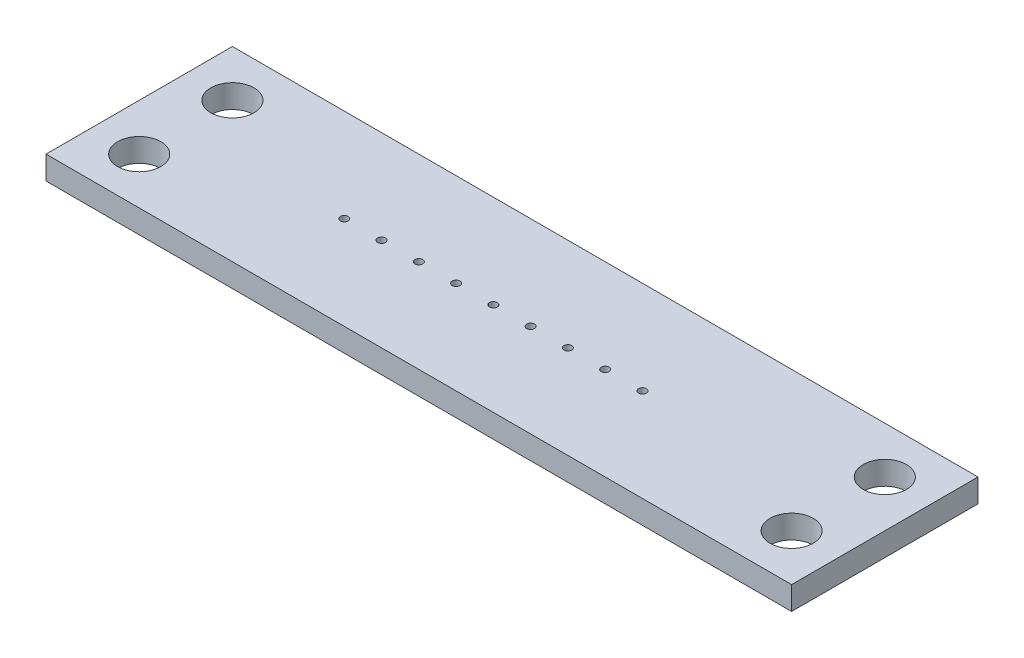
ISO-10303-21;
HEADER;
FILE_DESCRIPTION(('STEP AP214'),'2;1');
FILE_NAME('part.step','',(''),(''),'','','');
FILE_SCHEMA(('AUTOMOTIVE_DESIGN { 1 0 10303 214 1 1 1 1 }'));
ENDSEC;
DATA;
#1=APPLICATION_CONTEXT('core data for automotive mechanical design processes');
#2=APPLICATION_PROTOCOL_DEFINITION('international standard','automotive_design',2000,#1);
#3=PRODUCT_CONTEXT('',#1,'mechanical');
#4=PRODUCT('Part','Part','',(#3));
#5=PRODUCT_RELATED_PRODUCT_CATEGORY('part','',(#4));
#6=PRODUCT_DEFINITION_FORMATION('','',#4);
#7=PRODUCT_DEFINITION_CONTEXT('part definition',#1,'design');
#8=PRODUCT_DEFINITION('design','',#6,#7);
#9=PRODUCT_DEFINITION_SHAPE('','',#8);
#10=(LENGTH_UNIT() NAMED_UNIT(*) SI_UNIT(.MILLI.,.METRE.));
#11=(NAMED_UNIT(*) PLANE_ANGLE_UNIT() SI_UNIT($,.RADIAN.));
#12=(NAMED_UNIT(*) SI_UNIT($,.STERADIAN.) SOLID_ANGLE_UNIT());
#13=UNCERTAINTY_MEASURE_WITH_UNIT(LENGTH_MEASURE(1.E-05),#10,'distance_accuracy_value','');
#14=(GEOMETRIC_REPRESENTATION_CONTEXT(3) GLOBAL_UNCERTAINTY_ASSIGNED_CONTEXT((#13)) GLOBAL_UNIT_ASSIGNED_CONTEXT((#10,
#11,#12)) REPRESENTATION_CONTEXT('',''));
#15=CARTESIAN_POINT('',(0.,0.,0.));
#16=DIRECTION('',(0.,0.,1.));
#17=DIRECTION('',(1.,0.,0.));
#18=AXIS2_PLACEMENT_3D('',#15,#16,#17);
#19=CARTESIAN_POINT('',(0.,1.5875,0.));
#20=DIRECTION('',(1.,0.,0.));
#21=DIRECTION('',(0.,0.,-1.));
#22=AXIS2_PLACEMENT_3D('',#19,#20,#21);
#23=PLANE('',#22);
#24=DIRECTION('',(0.,0.,1.));
#25=VECTOR('',#24,1.);
#26=CARTESIAN_POINT('',(0.,0.,0.));
#27=LINE('',#26,#25);
#28=CARTESIAN_POINT('',(0.,0.,-12.7));
#29=VERTEX_POINT('',#28);
#30=CARTESIAN_POINT('',(0.,0.,0.));
#31=VERTEX_POINT('',#30);
#32=EDGE_CURVE('E96',#29,#31,#27,.T.);
#33=ORIENTED_EDGE('',*,*,#32,.T.);
#34=DIRECTION('',(0.,-1.,0.));
#35=VECTOR('',#34,1.);
#36=CARTESIAN_POINT('',(0.,1.5875,0.));
#37=LINE('',#36,#35);
#38=CARTESIAN_POINT('',(0.,1.5875,0.));
#39=VERTEX_POINT('',#38);
#40=EDGE_CURVE('E11',#39,#31,#37,.T.);
#41=ORIENTED_EDGE('',*,*,#40,.F.);
#42=DIRECTION('',(0.,0.,1.));
#43=VECTOR('',#42,1.);
#44=CARTESIAN_POINT('',(0.,1.5875,0.));
#45=LINE('',#44,#43);
#46=CARTESIAN_POINT('',(0.,1.5875,-12.7));
#47=VERTEX_POINT('',#46);
#48=EDGE_CURVE('E84',#47,#39,#45,.T.);
#49=ORIENTED_EDGE('',*,*,#48,.F.);
#50=DIRECTION('',(0.,-1.,0.));
#51=VECTOR('',#50,1.);
#52=CARTESIAN_POINT('',(0.,1.5875,-12.7));
#53=LINE('',#52,#51);
#54=EDGE_CURVE('E92',#47,#29,#53,.T.);
#55=ORIENTED_EDGE('',*,*,#54,.T.);
#56=EDGE_LOOP('',(#33,#41,#49,#55));
#57=FACE_BOUND('',#56,.T.);
#58=ADVANCED_FACE('F33',(#57),#23,.F.);
#59=CARTESIAN_POINT('',(0.,1.5875,0.));
#60=DIRECTION('',(0.,0.,-1.));
#61=DIRECTION('',(-1.,0.,0.));
#62=AXIS2_PLACEMENT_3D('',#59,#60,#61);
#63=PLANE('',#62);
#64=DIRECTION('',(1.,0.,0.));
#65=VECTOR('',#64,1.);
#66=CARTESIAN_POINT('',(0.,0.,0.));
#67=LINE('',#66,#65);
#68=CARTESIAN_POINT('',(50.8,0.,0.));
#69=VERTEX_POINT('',#68);
#70=EDGE_CURVE('E88',#31,#69,#67,.T.);
#71=ORIENTED_EDGE('',*,*,#70,.T.);
#72=DIRECTION('',(0.,-1.,0.));
#73=VECTOR('',#72,1.);
#74=CARTESIAN_POINT('',(50.8,1.5875,0.));
#75=LINE('',#74,#73);
#76=CARTESIAN_POINT('',(50.8,1.5875,0.));
#77=VERTEX_POINT('',#76);
#78=EDGE_CURVE('E41',#77,#69,#75,.T.);
#79=ORIENTED_EDGE('',*,*,#78,.F.);
#80=DIRECTION('',(1.,0.,0.));
#81=VECTOR('',#80,1.);
#82=CARTESIAN_POINT('',(0.,1.5875,0.));
#83=LINE('',#82,#81);
#84=EDGE_CURVE('E79',#39,#77,#83,.T.);
#85=ORIENTED_EDGE('',*,*,#84,.F.);
#86=ORIENTED_EDGE('',*,*,#40,.T.);
#87=EDGE_LOOP('',(#71,#79,#85,#86));
#88=FACE_BOUND('',#87,.T.);
#89=ADVANCED_FACE('F87',(#88),#63,.F.);
#90=CARTESIAN_POINT('',(50.8,1.5875,0.));
#91=DIRECTION('',(-1.,0.,0.));
#92=DIRECTION('',(0.,0.,1.));
#93=AXIS2_PLACEMENT_3D('',#90,#91,#92);
#94=PLANE('',#93);
#95=DIRECTION('',(0.,0.,-1.));
#96=VECTOR('',#95,1.);
#97=CARTESIAN_POINT('',(50.8,0.,0.));
#98=LINE('',#97,#96);
#99=CARTESIAN_POINT('',(50.8,0.,-12.7));
#100=VERTEX_POINT('',#99);
#101=EDGE_CURVE('E66',#69,#100,#98,.T.);
#102=ORIENTED_EDGE('',*,*,#101,.T.);
#103=DIRECTION('',(0.,-1.,0.));
#104=VECTOR('',#103,1.);
#105=CARTESIAN_POINT('',(50.8,1.5875,-12.7));
#106=LINE('',#105,#104);
#107=CARTESIAN_POINT('',(50.8,1.5875,-12.7));
#108=VERTEX_POINT('',#107);
#109=EDGE_CURVE('E89',#108,#100,#106,.T.);
#110=ORIENTED_EDGE('',*,*,#109,.F.);
#111=DIRECTION('',(0.,0.,-1.));
#112=VECTOR('',#111,1.);
#113=CARTESIAN_POINT('',(50.8,1.5875,0.));
#114=LINE('',#113,#112);
#115=EDGE_CURVE('E82',#77,#108,#114,.T.);
#116=ORIENTED_EDGE('',*,*,#115,.F.);
#117=ORIENTED_EDGE('',*,*,#78,.T.);
#118=EDGE_LOOP('',(#102,#110,#116,#117));
#119=FACE_BOUND('',#118,.T.);
#120=ADVANCED_FACE('F90',(#119),#94,.F.);
#121=CARTESIAN_POINT('',(0.,1.5875,-12.7));
#122=DIRECTION('',(0.,0.,1.));
#123=DIRECTION('',(1.,0.,0.));
#124=AXIS2_PLACEMENT_3D('',#121,#122,#123);
#125=PLANE('',#124);
#126=DIRECTION('',(-1.,0.,0.));
#127=VECTOR('',#126,1.);
#128=CARTESIAN_POINT('',(0.,0.,-12.7));
#129=LINE('',#128,#127);
#130=EDGE_CURVE('E72',#100,#29,#129,.T.);
#131=ORIENTED_EDGE('',*,*,#130,.T.);
#132=ORIENTED_EDGE('',*,*,#54,.F.);
#133=DIRECTION('',(-1.,0.,0.));
#134=VECTOR('',#133,1.);
#135=CARTESIAN_POINT('',(0.,1.5875,-12.7));
#136=LINE('',#135,#134);
#137=EDGE_CURVE('E49',#108,#47,#136,.T.);
#138=ORIENTED_EDGE('',*,*,#137,.F.);
#139=ORIENTED_EDGE('',*,*,#109,.T.);
#140=EDGE_LOOP('',(#131,#132,#138,#139));
#141=FACE_BOUND('',#140,.T.);
#142=ADVANCED_FACE('F104',(#141),#125,.F.);
#143=CARTESIAN_POINT('',(0.,1.5875,0.));
#144=DIRECTION('',(0.,-1.,0.));
#145=DIRECTION('',(0.,0.,-1.));
#146=AXIS2_PLACEMENT_3D('',#143,#144,#145);
#147=PLANE('',#146);
#148=CARTESIAN_POINT('',(34.29,1.5875,-6.35));
#149=DIRECTION('',(0.,1.,0.));
#150=DIRECTION('',(0.,0.,1.));
#151=AXIS2_PLACEMENT_3D('',#148,#149,#150);
#152=CIRCLE('',#151,0.266700000000002);
#153=CARTESIAN_POINT('',(34.29,1.5875,-6.0833));
#154=VERTEX_POINT('',#153);
#155=EDGE_CURVE('E140',#154,#154,#152,.T.);
#156=ORIENTED_EDGE('',*,*,#155,.F.);
#157=EDGE_LOOP('',(#156));
#158=FACE_BOUND('',#157,.T.);
#159=CARTESIAN_POINT('',(31.75,1.5875,-6.35));
#160=DIRECTION('',(0.,1.,0.));
#161=DIRECTION('',(0.,0.,1.));
#162=AXIS2_PLACEMENT_3D('',#159,#160,#161);
#163=CIRCLE('',#162,0.266700000000002);
#164=CARTESIAN_POINT('',(31.75,1.5875,-6.0833));
#165=VERTEX_POINT('',#164);
#166=EDGE_CURVE('E146',#165,#165,#163,.T.);
#167=ORIENTED_EDGE('',*,*,#166,.F.);
#168=EDGE_LOOP('',(#167));
#169=FACE_BOUND('',#168,.T.);
#170=CARTESIAN_POINT('',(29.21,1.5875,-6.35));
#171=DIRECTION('',(0.,1.,0.));
#172=DIRECTION('',(0.,0.,1.));
#173=AXIS2_PLACEMENT_3D('',#170,#171,#172);
#174=CIRCLE('',#173,0.266700000000002);
#175=CARTESIAN_POINT('',(29.21,1.5875,-6.0833));
#176=VERTEX_POINT('',#175);
#177=EDGE_CURVE('E152',#176,#176,#174,.T.);
#178=ORIENTED_EDGE('',*,*,#177,.F.);
#179=EDGE_LOOP('',(#178));
#180=FACE_BOUND('',#179,.T.);
#181=CARTESIAN_POINT('',(26.67,1.5875,-6.35));
#182=DIRECTION('',(0.,1.,0.));
#183=DIRECTION('',(0.,0.,1.));
#184=AXIS2_PLACEMENT_3D('',#181,#182,#183);
#185=CIRCLE('',#184,0.266700000000002);
#186=CARTESIAN_POINT('',(26.67,1.5875,-6.0833));
#187=VERTEX_POINT('',#186);
#188=EDGE_CURVE('E158',#187,#187,#185,.T.);
#189=ORIENTED_EDGE('',*,*,#188,.F.);
#190=EDGE_LOOP('',(#189));
#191=FACE_BOUND('',#190,.T.);
#192=CARTESIAN_POINT('',(13.97,1.5875,-6.34999999999993));
#193=DIRECTION('',(0.,1.,0.));
#194=DIRECTION('',(0.,0.,1.));
#195=AXIS2_PLACEMENT_3D('',#192,#193,#194);
#196=CIRCLE('',#195,0.266700000000002);
#197=CARTESIAN_POINT('',(13.97,1.5875,-6.08329999999993));
#198=VERTEX_POINT('',#197);
#199=EDGE_CURVE('E164',#198,#198,#196,.T.);
#200=ORIENTED_EDGE('',*,*,#199,.F.);
#201=EDGE_LOOP('',(#200));
#202=FACE_BOUND('',#201,.T.);
#203=CARTESIAN_POINT('',(16.51,1.5875,-6.34999999999995));
#204=DIRECTION('',(0.,1.,0.));
#205=DIRECTION('',(0.,0.,1.));
#206=AXIS2_PLACEMENT_3D('',#203,#204,#205);
#207=CIRCLE('',#206,0.266700000000002);
#208=CARTESIAN_POINT('',(16.51,1.5875,-6.08329999999994));
#209=VERTEX_POINT('',#208);
#210=EDGE_CURVE('E170',#209,#209,#207,.T.);
#211=ORIENTED_EDGE('',*,*,#210,.F.);
#212=EDGE_LOOP('',(#211));
#213=FACE_BOUND('',#212,.T.);
#214=CARTESIAN_POINT('',(19.05,1.5875,-6.34999999999996));
#215=DIRECTION('',(0.,1.,0.));
#216=DIRECTION('',(0.,0.,1.));
#217=AXIS2_PLACEMENT_3D('',#214,#215,#216);
#218=CIRCLE('',#217,0.266700000000002);
#219=CARTESIAN_POINT('',(19.05,1.5875,-6.08329999999996));
#220=VERTEX_POINT('',#219);
#221=EDGE_CURVE('E176',#220,#220,#218,.T.);
#222=ORIENTED_EDGE('',*,*,#221,.F.);
#223=EDGE_LOOP('',(#222));
#224=FACE_BOUND('',#223,.T.);
#225=CARTESIAN_POINT('',(21.59,1.5875,-6.34999999999998));
#226=DIRECTION('',(0.,1.,0.));
#227=DIRECTION('',(0.,0.,1.));
#228=AXIS2_PLACEMENT_3D('',#225,#226,#227);
#229=CIRCLE('',#228,0.266700000000002);
#230=CARTESIAN_POINT('',(21.59,1.5875,-6.08329999999998));
#231=VERTEX_POINT('',#230);
#232=EDGE_CURVE('E182',#231,#231,#229,.T.);
#233=ORIENTED_EDGE('',*,*,#232,.F.);
#234=EDGE_LOOP('',(#233));
#235=FACE_BOUND('',#234,.T.);
#236=CARTESIAN_POINT('',(24.13,1.5875,-6.35));
#237=DIRECTION('',(0.,1.,0.));
#238=DIRECTION('',(0.,0.,1.));
#239=AXIS2_PLACEMENT_3D('',#236,#237,#238);
#240=CIRCLE('',#239,0.266700000000002);
#241=CARTESIAN_POINT('',(24.13,1.5875,-6.0833));
#242=VERTEX_POINT('',#241);
#243=EDGE_CURVE('E134',#242,#242,#240,.T.);
#244=ORIENTED_EDGE('',*,*,#243,.F.);
#245=EDGE_LOOP('',(#244));
#246=FACE_BOUND('',#245,.T.);
#247=CARTESIAN_POINT('',(3.175,1.5875,-3.175));
#248=DIRECTION('',(0.,1.,0.));
#249=DIRECTION('',(0.,0.,-1.));
#250=AXIS2_PLACEMENT_3D('',#247,#248,#249);
#251=CIRCLE('',#250,1.4732);
#252=CARTESIAN_POINT('',(3.175,1.5875,-4.6482));
#253=VERTEX_POINT('',#252);
#254=EDGE_CURVE('E123',#253,#253,#251,.T.);
#255=ORIENTED_EDGE('',*,*,#254,.F.);
#256=EDGE_LOOP('',(#255));
#257=FACE_BOUND('',#256,.T.);
#258=CARTESIAN_POINT('',(47.625,1.5875,-9.525));
#259=DIRECTION('',(0.,1.,0.));
#260=DIRECTION('',(0.,0.,-1.));
#261=AXIS2_PLACEMENT_3D('',#258,#259,#260);
#262=CIRCLE('',#261,1.4732);
#263=CARTESIAN_POINT('',(47.625,1.5875,-10.9982));
#264=VERTEX_POINT('',#263);
#265=EDGE_CURVE('E116',#264,#264,#262,.T.);
#266=ORIENTED_EDGE('',*,*,#265,.F.);
#267=EDGE_LOOP('',(#266));
#268=FACE_BOUND('',#267,.T.);
#269=CARTESIAN_POINT('',(47.625,1.5875,-3.17500000000001));
#270=DIRECTION('',(0.,1.,0.));
#271=DIRECTION('',(0.,0.,1.));
#272=AXIS2_PLACEMENT_3D('',#269,#270,#271);
#273=CIRCLE('',#272,1.4732);
#274=CARTESIAN_POINT('',(47.625,1.5875,-1.70180000000002));
#275=VERTEX_POINT('',#274);
#276=EDGE_CURVE('E128',#275,#275,#273,.T.);
#277=ORIENTED_EDGE('',*,*,#276,.F.);
#278=EDGE_LOOP('',(#277));
#279=FACE_BOUND('',#278,.T.);
#280=CARTESIAN_POINT('',(3.175,1.5875,-9.525));
#281=DIRECTION('',(0.,1.,0.));
#282=DIRECTION('',(0.,0.,1.));
#283=AXIS2_PLACEMENT_3D('',#280,#281,#282);
#284=CIRCLE('',#283,1.4732);
#285=CARTESIAN_POINT('',(3.175,1.5875,-8.0518));
#286=VERTEX_POINT('',#285);
#287=EDGE_CURVE('E110',#286,#286,#284,.T.);
#288=ORIENTED_EDGE('',*,*,#287,.F.);
#289=EDGE_LOOP('',(#288));
#290=FACE_BOUND('',#289,.T.);
#291=ORIENTED_EDGE('',*,*,#48,.T.);
#292=ORIENTED_EDGE('',*,*,#84,.T.);
#293=ORIENTED_EDGE('',*,*,#115,.T.);
#294=ORIENTED_EDGE('',*,*,#137,.T.);
#295=EDGE_LOOP('',(#291,#292,#293,#294));
#296=FACE_BOUND('',#295,.T.);
#297=ADVANCED_FACE('F80',(#158,#169,#180,#191,#202,#213,#224,#235,#246,#257,#268,#279,#290,
#296),#147,.F.);
#298=CARTESIAN_POINT('',(0.,0.,0.));
#299=DIRECTION('',(0.,-1.,0.));
#300=DIRECTION('',(0.,0.,-1.));
#301=AXIS2_PLACEMENT_3D('',#298,#299,#300);
#302=PLANE('',#301);
#303=CARTESIAN_POINT('',(34.29,0.,-6.35));
#304=DIRECTION('',(0.,1.,0.));
#305=DIRECTION('',(0.,0.,1.));
#306=AXIS2_PLACEMENT_3D('',#303,#304,#305);
#307=CIRCLE('',#306,0.266700000000002);
#308=CARTESIAN_POINT('',(34.29,0.,-6.0833));
#309=VERTEX_POINT('',#308);
#310=EDGE_CURVE('E143',#309,#309,#307,.T.);
#311=ORIENTED_EDGE('',*,*,#310,.T.);
#312=EDGE_LOOP('',(#311));
#313=FACE_BOUND('',#312,.T.);
#314=CARTESIAN_POINT('',(31.75,0.,-6.35));
#315=DIRECTION('',(0.,1.,0.));
#316=DIRECTION('',(0.,0.,1.));
#317=AXIS2_PLACEMENT_3D('',#314,#315,#316);
#318=CIRCLE('',#317,0.266700000000002);
#319=CARTESIAN_POINT('',(31.75,0.,-6.0833));
#320=VERTEX_POINT('',#319);
#321=EDGE_CURVE('E149',#320,#320,#318,.T.);
#322=ORIENTED_EDGE('',*,*,#321,.T.);
#323=EDGE_LOOP('',(#322));
#324=FACE_BOUND('',#323,.T.);
#325=CARTESIAN_POINT('',(29.21,0.,-6.35));
#326=DIRECTION('',(0.,1.,0.));
#327=DIRECTION('',(0.,0.,1.));
#328=AXIS2_PLACEMENT_3D('',#325,#326,#327);
#329=CIRCLE('',#328,0.266700000000002);
#330=CARTESIAN_POINT('',(29.21,0.,-6.0833));
#331=VERTEX_POINT('',#330);
#332=EDGE_CURVE('E155',#331,#331,#329,.T.);
#333=ORIENTED_EDGE('',*,*,#332,.T.);
#334=EDGE_LOOP('',(#333));
#335=FACE_BOUND('',#334,.T.);
#336=CARTESIAN_POINT('',(26.67,0.,-6.35));
#337=DIRECTION('',(0.,1.,0.));
#338=DIRECTION('',(0.,0.,1.));
#339=AXIS2_PLACEMENT_3D('',#336,#337,#338);
#340=CIRCLE('',#339,0.266700000000002);
#341=CARTESIAN_POINT('',(26.67,0.,-6.0833));
#342=VERTEX_POINT('',#341);
#343=EDGE_CURVE('E161',#342,#342,#340,.T.);
#344=ORIENTED_EDGE('',*,*,#343,.T.);
#345=EDGE_LOOP('',(#344));
#346=FACE_BOUND('',#345,.T.);
#347=CARTESIAN_POINT('',(13.97,0.,-6.34999999999993));
#348=DIRECTION('',(0.,1.,0.));
#349=DIRECTION('',(0.,0.,1.));
#350=AXIS2_PLACEMENT_3D('',#347,#348,#349);
#351=CIRCLE('',#350,0.266700000000002);
#352=CARTESIAN_POINT('',(13.97,0.,-6.08329999999993));
#353=VERTEX_POINT('',#352);
#354=EDGE_CURVE('E167',#353,#353,#351,.T.);
#355=ORIENTED_EDGE('',*,*,#354,.T.);
#356=EDGE_LOOP('',(#355));
#357=FACE_BOUND('',#356,.T.);
#358=CARTESIAN_POINT('',(16.51,0.,-6.34999999999995));
#359=DIRECTION('',(0.,1.,0.));
#360=DIRECTION('',(0.,0.,1.));
#361=AXIS2_PLACEMENT_3D('',#358,#359,#360);
#362=CIRCLE('',#361,0.266700000000002);
#363=CARTESIAN_POINT('',(16.51,0.,-6.08329999999994));
#364=VERTEX_POINT('',#363);
#365=EDGE_CURVE('E173',#364,#364,#362,.T.);
#366=ORIENTED_EDGE('',*,*,#365,.T.);
#367=EDGE_LOOP('',(#366));
#368=FACE_BOUND('',#367,.T.);
#369=CARTESIAN_POINT('',(19.05,0.,-6.34999999999996));
#370=DIRECTION('',(0.,1.,0.));
#371=DIRECTION('',(0.,0.,1.));
#372=AXIS2_PLACEMENT_3D('',#369,#370,#371);
#373=CIRCLE('',#372,0.266700000000002);
#374=CARTESIAN_POINT('',(19.05,0.,-6.08329999999996));
#375=VERTEX_POINT('',#374);
#376=EDGE_CURVE('E179',#375,#375,#373,.T.);
#377=ORIENTED_EDGE('',*,*,#376,.T.);
#378=EDGE_LOOP('',(#377));
#379=FACE_BOUND('',#378,.T.);
#380=CARTESIAN_POINT('',(21.59,0.,-6.34999999999998));
#381=DIRECTION('',(0.,1.,0.));
#382=DIRECTION('',(0.,0.,1.));
#383=AXIS2_PLACEMENT_3D('',#380,#381,#382);
#384=CIRCLE('',#383,0.266700000000002);
#385=CARTESIAN_POINT('',(21.59,0.,-6.08329999999998));
#386=VERTEX_POINT('',#385);
#387=EDGE_CURVE('E137',#386,#386,#384,.T.);
#388=ORIENTED_EDGE('',*,*,#387,.T.);
#389=EDGE_LOOP('',(#388));
#390=FACE_BOUND('',#389,.T.);
#391=CARTESIAN_POINT('',(24.13,0.,-6.35));
#392=DIRECTION('',(0.,1.,0.));
#393=DIRECTION('',(0.,0.,1.));
#394=AXIS2_PLACEMENT_3D('',#391,#392,#393);
#395=CIRCLE('',#394,0.266700000000002);
#396=CARTESIAN_POINT('',(24.13,0.,-6.0833));
#397=VERTEX_POINT('',#396);
#398=EDGE_CURVE('E131',#397,#397,#395,.T.);
#399=ORIENTED_EDGE('',*,*,#398,.T.);
#400=EDGE_LOOP('',(#399));
#401=FACE_BOUND('',#400,.T.);
#402=CARTESIAN_POINT('',(3.175,0.,-3.175));
#403=DIRECTION('',(0.,1.,0.));
#404=DIRECTION('',(0.,0.,-1.));
#405=AXIS2_PLACEMENT_3D('',#402,#403,#404);
#406=CIRCLE('',#405,1.4732);
#407=CARTESIAN_POINT('',(3.175,0.,-4.6482));
#408=VERTEX_POINT('',#407);
#409=EDGE_CURVE('E113',#408,#408,#406,.T.);
#410=ORIENTED_EDGE('',*,*,#409,.T.);
#411=EDGE_LOOP('',(#410));
#412=FACE_BOUND('',#411,.T.);
#413=CARTESIAN_POINT('',(47.625,0.,-9.525));
#414=DIRECTION('',(0.,1.,0.));
#415=DIRECTION('',(0.,0.,-1.));
#416=AXIS2_PLACEMENT_3D('',#413,#414,#415);
#417=CIRCLE('',#416,1.4732);
#418=CARTESIAN_POINT('',(47.625,0.,-10.9982));
#419=VERTEX_POINT('',#418);
#420=EDGE_CURVE('E119',#419,#419,#417,.T.);
#421=ORIENTED_EDGE('',*,*,#420,.T.);
#422=EDGE_LOOP('',(#421));
#423=FACE_BOUND('',#422,.T.);
#424=CARTESIAN_POINT('',(47.625,0.,-3.17500000000001));
#425=DIRECTION('',(0.,1.,0.));
#426=DIRECTION('',(0.,0.,1.));
#427=AXIS2_PLACEMENT_3D('',#424,#425,#426);
#428=CIRCLE('',#427,1.4732);
#429=CARTESIAN_POINT('',(47.625,0.,-1.70180000000002));
#430=VERTEX_POINT('',#429);
#431=EDGE_CURVE('E120',#430,#430,#428,.T.);
#432=ORIENTED_EDGE('',*,*,#431,.T.);
#433=EDGE_LOOP('',(#432));
#434=FACE_BOUND('',#433,.T.);
#435=CARTESIAN_POINT('',(3.175,0.,-9.525));
#436=DIRECTION('',(0.,1.,0.));
#437=DIRECTION('',(0.,0.,1.));
#438=AXIS2_PLACEMENT_3D('',#435,#436,#437);
#439=CIRCLE('',#438,1.4732);
#440=CARTESIAN_POINT('',(3.175,0.,-8.0518));
#441=VERTEX_POINT('',#440);
#442=EDGE_CURVE('E99',#441,#441,#439,.T.);
#443=ORIENTED_EDGE('',*,*,#442,.T.);
#444=EDGE_LOOP('',(#443));
#445=FACE_BOUND('',#444,.T.);
#446=ORIENTED_EDGE('',*,*,#32,.F.);
#447=ORIENTED_EDGE('',*,*,#130,.F.);
#448=ORIENTED_EDGE('',*,*,#101,.F.);
#449=ORIENTED_EDGE('',*,*,#70,.F.);
#450=EDGE_LOOP('',(#446,#447,#448,#449));
#451=FACE_BOUND('',#450,.T.);
#452=ADVANCED_FACE('F107',(#313,#324,#335,#346,#357,#368,#379,#390,#401,#412,#423,#434,#445,
#451),#302,.T.);
#453=CARTESIAN_POINT('',(3.175,0.,-9.525));
#454=DIRECTION('',(0.,1.,0.));
#455=DIRECTION('',(0.,0.,1.));
#456=AXIS2_PLACEMENT_3D('',#453,#454,#455);
#457=CYLINDRICAL_SURFACE('',#456,1.4732);
#458=ORIENTED_EDGE('',*,*,#442,.F.);
#459=EDGE_LOOP('',(#458));
#460=FACE_BOUND('',#459,.T.);
#461=ORIENTED_EDGE('',*,*,#287,.T.);
#462=EDGE_LOOP('',(#461));
#463=FACE_BOUND('',#462,.T.);
#464=ADVANCED_FACE('F212',(#460,#463),#457,.F.);
#465=CARTESIAN_POINT('',(47.625,0.,-3.17500000000001));
#466=DIRECTION('',(0.,1.,0.));
#467=DIRECTION('',(0.,0.,1.));
#468=AXIS2_PLACEMENT_3D('',#465,#466,#467);
#469=CYLINDRICAL_SURFACE('',#468,1.4732);
#470=ORIENTED_EDGE('',*,*,#431,.F.);
#471=EDGE_LOOP('',(#470));
#472=FACE_BOUND('',#471,.T.);
#473=ORIENTED_EDGE('',*,*,#276,.T.);
#474=EDGE_LOOP('',(#473));
#475=FACE_BOUND('',#474,.T.);
#476=ADVANCED_FACE('F214',(#472,#475),#469,.F.);
#477=CARTESIAN_POINT('',(47.625,0.,-9.525));
#478=DIRECTION('',(0.,1.,0.));
#479=DIRECTION('',(0.,0.,1.));
#480=AXIS2_PLACEMENT_3D('',#477,#478,#479);
#481=CYLINDRICAL_SURFACE('',#480,1.4732);
#482=ORIENTED_EDGE('',*,*,#420,.F.);
#483=EDGE_LOOP('',(#482));
#484=FACE_BOUND('',#483,.T.);
#485=ORIENTED_EDGE('',*,*,#265,.T.);
#486=EDGE_LOOP('',(#485));
#487=FACE_BOUND('',#486,.T.);
#488=ADVANCED_FACE('F221',(#484,#487),#481,.F.);
#489=CARTESIAN_POINT('',(3.175,0.,-3.175));
#490=DIRECTION('',(0.,1.,0.));
#491=DIRECTION('',(0.,0.,1.));
#492=AXIS2_PLACEMENT_3D('',#489,#490,#491);
#493=CYLINDRICAL_SURFACE('',#492,1.4732);
#494=ORIENTED_EDGE('',*,*,#409,.F.);
#495=EDGE_LOOP('',(#494));
#496=FACE_BOUND('',#495,.T.);
#497=ORIENTED_EDGE('',*,*,#254,.T.);
#498=EDGE_LOOP('',(#497));
#499=FACE_BOUND('',#498,.T.);
#500=ADVANCED_FACE('F261',(#496,#499),#493,.F.);
#501=CARTESIAN_POINT('',(24.13,0.,-6.35));
#502=DIRECTION('',(0.,1.,0.));
#503=DIRECTION('',(0.,0.,1.));
#504=AXIS2_PLACEMENT_3D('',#501,#502,#503);
#505=CYLINDRICAL_SURFACE('',#504,0.266700000000002);
#506=ORIENTED_EDGE('',*,*,#398,.F.);
#507=EDGE_LOOP('',(#506));
#508=FACE_BOUND('',#507,.T.);
#509=ORIENTED_EDGE('',*,*,#243,.T.);
#510=EDGE_LOOP('',(#509));
#511=FACE_BOUND('',#510,.T.);
#512=ADVANCED_FACE('F194',(#508,#511),#505,.F.);
#513=CARTESIAN_POINT('',(21.59,0.,-6.34999999999998));
#514=DIRECTION('',(0.,1.,0.));
#515=DIRECTION('',(0.,0.,1.));
#516=AXIS2_PLACEMENT_3D('',#513,#514,#515);
#517=CYLINDRICAL_SURFACE('',#516,0.266700000000002);
#518=ORIENTED_EDGE('',*,*,#387,.F.);
#519=EDGE_LOOP('',(#518));
#520=FACE_BOUND('',#519,.T.);
#521=ORIENTED_EDGE('',*,*,#232,.T.);
#522=EDGE_LOOP('',(#521));
#523=FACE_BOUND('',#522,.T.);
#524=ADVANCED_FACE('F190',(#520,#523),#517,.F.);
#525=CARTESIAN_POINT('',(19.05,0.,-6.34999999999996));
#526=DIRECTION('',(0.,1.,0.));
#527=DIRECTION('',(0.,0.,1.));
#528=AXIS2_PLACEMENT_3D('',#525,#526,#527);
#529=CYLINDRICAL_SURFACE('',#528,0.266700000000002);
#530=ORIENTED_EDGE('',*,*,#376,.F.);
#531=EDGE_LOOP('',(#530));
#532=FACE_BOUND('',#531,.T.);
#533=ORIENTED_EDGE('',*,*,#221,.T.);
#534=EDGE_LOOP('',(#533));
#535=FACE_BOUND('',#534,.T.);
#536=ADVANCED_FACE('F193',(#532,#535),#529,.F.);
#537=CARTESIAN_POINT('',(16.51,0.,-6.34999999999995));
#538=DIRECTION('',(0.,1.,0.));
#539=DIRECTION('',(0.,0.,1.));
#540=AXIS2_PLACEMENT_3D('',#537,#538,#539);
#541=CYLINDRICAL_SURFACE('',#540,0.266700000000002);
#542=ORIENTED_EDGE('',*,*,#365,.F.);
#543=EDGE_LOOP('',(#542));
#544=FACE_BOUND('',#543,.T.);
#545=ORIENTED_EDGE('',*,*,#210,.T.);
#546=EDGE_LOOP('',(#545));
#547=FACE_BOUND('',#546,.T.);
#548=ADVANCED_FACE('F279',(#544,#547),#541,.F.);
#549=CARTESIAN_POINT('',(13.97,0.,-6.34999999999993));
#550=DIRECTION('',(0.,1.,0.));
#551=DIRECTION('',(0.,0.,1.));
#552=AXIS2_PLACEMENT_3D('',#549,#550,#551);
#553=CYLINDRICAL_SURFACE('',#552,0.266700000000002);
#554=ORIENTED_EDGE('',*,*,#354,.F.);
#555=EDGE_LOOP('',(#554));
#556=FACE_BOUND('',#555,.T.);
#557=ORIENTED_EDGE('',*,*,#199,.T.);
#558=EDGE_LOOP('',(#557));
#559=FACE_BOUND('',#558,.T.);
#560=ADVANCED_FACE('F289',(#556,#559),#553,.F.);
#561=CARTESIAN_POINT('',(26.67,0.,-6.35));
#562=DIRECTION('',(0.,1.,0.));
#563=DIRECTION('',(0.,0.,1.));
#564=AXIS2_PLACEMENT_3D('',#561,#562,#563);
#565=CYLINDRICAL_SURFACE('',#564,0.266700000000002);
#566=ORIENTED_EDGE('',*,*,#343,.F.);
#567=EDGE_LOOP('',(#566));
#568=FACE_BOUND('',#567,.T.);
#569=ORIENTED_EDGE('',*,*,#188,.T.);
#570=EDGE_LOOP('',(#569));
#571=FACE_BOUND('',#570,.T.);
#572=ADVANCED_FACE('F299',(#568,#571),#565,.F.);
#573=CARTESIAN_POINT('',(29.21,0.,-6.35));
#574=DIRECTION('',(0.,1.,0.));
#575=DIRECTION('',(0.,0.,1.));
#576=AXIS2_PLACEMENT_3D('',#573,#574,#575);
#577=CYLINDRICAL_SURFACE('',#576,0.266700000000002);
#578=ORIENTED_EDGE('',*,*,#332,.F.);
#579=EDGE_LOOP('',(#578));
#580=FACE_BOUND('',#579,.T.);
#581=ORIENTED_EDGE('',*,*,#177,.T.);
#582=EDGE_LOOP('',(#581));
#583=FACE_BOUND('',#582,.T.);
#584=ADVANCED_FACE('F309',(#580,#583),#577,.F.);
#585=CARTESIAN_POINT('',(31.75,0.,-6.35));
#586=DIRECTION('',(0.,1.,0.));
#587=DIRECTION('',(0.,0.,1.));
#588=AXIS2_PLACEMENT_3D('',#585,#586,#587);
#589=CYLINDRICAL_SURFACE('',#588,0.266700000000002);
#590=ORIENTED_EDGE('',*,*,#321,.F.);
#591=EDGE_LOOP('',(#590));
#592=FACE_BOUND('',#591,.T.);
#593=ORIENTED_EDGE('',*,*,#166,.T.);
#594=EDGE_LOOP('',(#593));
#595=FACE_BOUND('',#594,.T.);
#596=ADVANCED_FACE('F319',(#592,#595),#589,.F.);
#597=CARTESIAN_POINT('',(34.29,0.,-6.35));
#598=DIRECTION('',(0.,1.,0.));
#599=DIRECTION('',(0.,0.,1.));
#600=AXIS2_PLACEMENT_3D('',#597,#598,#599);
#601=CYLINDRICAL_SURFACE('',#600,0.266700000000002);
#602=ORIENTED_EDGE('',*,*,#310,.F.);
#603=EDGE_LOOP('',(#602));
#604=FACE_BOUND('',#603,.T.);
#605=ORIENTED_EDGE('',*,*,#155,.T.);
#606=EDGE_LOOP('',(#605));
#607=FACE_BOUND('',#606,.T.);
#608=ADVANCED_FACE('F329',(#604,#607),#601,.F.);
#609=CLOSED_SHELL('',(#58,#89,#120,#142,#297,#452,#464,#476,#488,#500,#512,#524,#536,#548,#560,
#572,#584,#596,#608));
#610=MANIFOLD_SOLID_BREP('B2',#609);
#611=ADVANCED_BREP_SHAPE_REPRESENTATION('',(#18,#610),#14);
#612=SHAPE_DEFINITION_REPRESENTATION(#9,#611);
ENDSEC;
END-ISO-10303-21;
